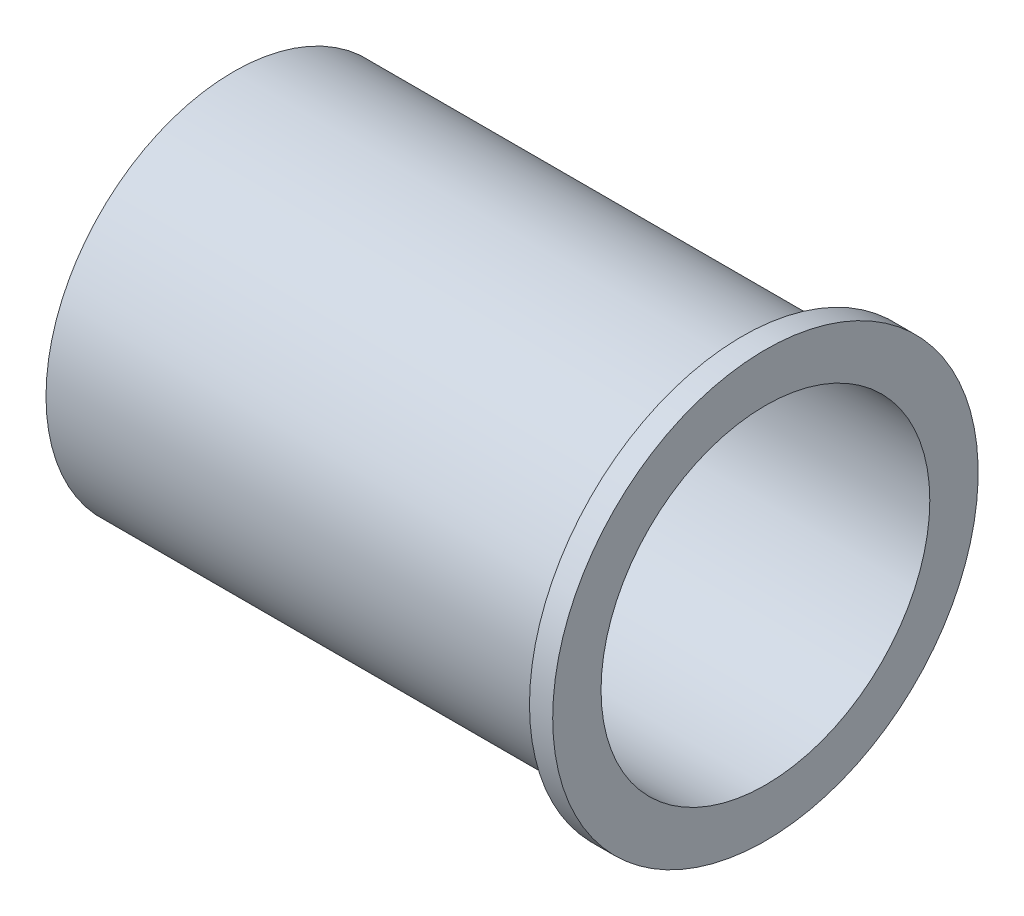
ISO-10303-21;
HEADER;
FILE_DESCRIPTION(('STEP AP214'),'2;1');
FILE_NAME('part.step','',(''),(''),'','','');
FILE_SCHEMA(('AUTOMOTIVE_DESIGN { 1 0 10303 214 1 1 1 1 }'));
ENDSEC;
DATA;
#1=APPLICATION_CONTEXT('core data for automotive mechanical design processes');
#2=APPLICATION_PROTOCOL_DEFINITION('international standard','automotive_design',2000,#1);
#3=PRODUCT_CONTEXT('',#1,'mechanical');
#4=PRODUCT('Part','Part','',(#3));
#5=PRODUCT_RELATED_PRODUCT_CATEGORY('part','',(#4));
#6=PRODUCT_DEFINITION_FORMATION('','',#4);
#7=PRODUCT_DEFINITION_CONTEXT('part definition',#1,'design');
#8=PRODUCT_DEFINITION('design','',#6,#7);
#9=PRODUCT_DEFINITION_SHAPE('','',#8);
#10=(LENGTH_UNIT() NAMED_UNIT(*) SI_UNIT(.MILLI.,.METRE.));
#11=(NAMED_UNIT(*) PLANE_ANGLE_UNIT() SI_UNIT($,.RADIAN.));
#12=(NAMED_UNIT(*) SI_UNIT($,.STERADIAN.) SOLID_ANGLE_UNIT());
#13=UNCERTAINTY_MEASURE_WITH_UNIT(LENGTH_MEASURE(1.E-05),#10,'distance_accuracy_value','');
#14=(GEOMETRIC_REPRESENTATION_CONTEXT(3) GLOBAL_UNCERTAINTY_ASSIGNED_CONTEXT((#13)) GLOBAL_UNIT_ASSIGNED_CONTEXT((#10,
#11,#12)) REPRESENTATION_CONTEXT('',''));
#15=CARTESIAN_POINT('',(0.,0.,0.));
#16=DIRECTION('',(0.,0.,1.));
#17=DIRECTION('',(1.,0.,0.));
#18=AXIS2_PLACEMENT_3D('',#15,#16,#17);
#19=CARTESIAN_POINT('',(-137.5,48.5,0.));
#20=DIRECTION('',(1.,0.,0.));
#21=DIRECTION('',(0.,0.,-1.));
#22=AXIS2_PLACEMENT_3D('',#19,#20,#21);
#23=PLANE('',#22);
#24=CARTESIAN_POINT('',(-137.5,0.,0.));
#25=DIRECTION('',(-1.,0.,0.));
#26=DIRECTION('',(0.,0.,1.));
#27=AXIS2_PLACEMENT_3D('',#24,#25,#26);
#28=CIRCLE('',#27,42.5);
#29=CARTESIAN_POINT('',(-137.5,0.,42.5));
#30=VERTEX_POINT('',#29);
#31=EDGE_CURVE('E10',#30,#30,#28,.T.);
#32=ORIENTED_EDGE('',*,*,#31,.F.);
#33=EDGE_LOOP('',(#32));
#34=FACE_BOUND('',#33,.T.);
#35=CARTESIAN_POINT('',(-137.5,0.,0.));
#36=DIRECTION('',(-1.,0.,0.));
#37=DIRECTION('',(0.,0.,1.));
#38=AXIS2_PLACEMENT_3D('',#35,#36,#37);
#39=CIRCLE('',#38,48.5);
#40=CARTESIAN_POINT('',(-137.5,0.,48.5));
#41=VERTEX_POINT('',#40);
#42=EDGE_CURVE('E60',#41,#41,#39,.T.);
#43=ORIENTED_EDGE('',*,*,#42,.T.);
#44=EDGE_LOOP('',(#43));
#45=FACE_BOUND('',#44,.T.);
#46=ADVANCED_FACE('F34',(#34,#45),#23,.F.);
#47=CARTESIAN_POINT('',(-94.8899371069183,0.,0.));
#48=DIRECTION('',(-1.,0.,0.));
#49=DIRECTION('',(0.,0.,1.));
#50=AXIS2_PLACEMENT_3D('',#47,#48,#49);
#51=CYLINDRICAL_SURFACE('',#50,42.5);
#52=CARTESIAN_POINT('',(0.,0.,0.));
#53=DIRECTION('',(-1.,0.,0.));
#54=DIRECTION('',(0.,0.,1.));
#55=AXIS2_PLACEMENT_3D('',#52,#53,#54);
#56=CIRCLE('',#55,42.5);
#57=CARTESIAN_POINT('',(0.,0.,42.5));
#58=VERTEX_POINT('',#57);
#59=EDGE_CURVE('E41',#58,#58,#56,.T.);
#60=ORIENTED_EDGE('',*,*,#59,.F.);
#61=EDGE_LOOP('',(#60));
#62=FACE_BOUND('',#61,.T.);
#63=ORIENTED_EDGE('',*,*,#31,.T.);
#64=EDGE_LOOP('',(#63));
#65=FACE_BOUND('',#64,.T.);
#66=ADVANCED_FACE('F85',(#62,#65),#51,.F.);
#67=CARTESIAN_POINT('',(0.,42.5,0.));
#68=DIRECTION('',(-1.,0.,0.));
#69=DIRECTION('',(0.,0.,1.));
#70=AXIS2_PLACEMENT_3D('',#67,#68,#69);
#71=PLANE('',#70);
#72=CARTESIAN_POINT('',(0.,0.,0.));
#73=DIRECTION('',(-1.,0.,0.));
#74=DIRECTION('',(0.,0.,1.));
#75=AXIS2_PLACEMENT_3D('',#72,#73,#74);
#76=CIRCLE('',#75,55.);
#77=CARTESIAN_POINT('',(0.,0.,55.));
#78=VERTEX_POINT('',#77);
#79=EDGE_CURVE('E44',#78,#78,#76,.T.);
#80=ORIENTED_EDGE('',*,*,#79,.F.);
#81=EDGE_LOOP('',(#80));
#82=FACE_BOUND('',#81,.T.);
#83=ORIENTED_EDGE('',*,*,#59,.T.);
#84=EDGE_LOOP('',(#83));
#85=FACE_BOUND('',#84,.T.);
#86=ADVANCED_FACE('F77',(#82,#85),#71,.F.);
#87=CARTESIAN_POINT('',(-94.8899371069183,0.,0.));
#88=DIRECTION('',(-1.,0.,0.));
#89=DIRECTION('',(0.,0.,1.));
#90=AXIS2_PLACEMENT_3D('',#87,#88,#89);
#91=CYLINDRICAL_SURFACE('',#90,55.);
#92=CARTESIAN_POINT('',(-5.99999999999999,0.,0.));
#93=DIRECTION('',(-1.,0.,0.));
#94=DIRECTION('',(0.,0.,1.));
#95=AXIS2_PLACEMENT_3D('',#92,#93,#94);
#96=CIRCLE('',#95,55.);
#97=CARTESIAN_POINT('',(-5.99999999999999,0.,55.));
#98=VERTEX_POINT('',#97);
#99=EDGE_CURVE('E47',#98,#98,#96,.T.);
#100=ORIENTED_EDGE('',*,*,#99,.F.);
#101=EDGE_LOOP('',(#100));
#102=FACE_BOUND('',#101,.T.);
#103=ORIENTED_EDGE('',*,*,#79,.T.);
#104=EDGE_LOOP('',(#103));
#105=FACE_BOUND('',#104,.T.);
#106=ADVANCED_FACE('F71',(#102,#105),#91,.T.);
#107=CARTESIAN_POINT('',(-5.99999999999999,48.5,0.));
#108=DIRECTION('',(1.,0.,0.));
#109=DIRECTION('',(0.,0.,-1.));
#110=AXIS2_PLACEMENT_3D('',#107,#108,#109);
#111=PLANE('',#110);
#112=CARTESIAN_POINT('',(-5.99999999999999,0.,0.));
#113=DIRECTION('',(-1.,0.,0.));
#114=DIRECTION('',(0.,0.,1.));
#115=AXIS2_PLACEMENT_3D('',#112,#113,#114);
#116=CIRCLE('',#115,48.5);
#117=CARTESIAN_POINT('',(-5.99999999999999,0.,48.5));
#118=VERTEX_POINT('',#117);
#119=EDGE_CURVE('E53',#118,#118,#116,.T.);
#120=ORIENTED_EDGE('',*,*,#119,.F.);
#121=EDGE_LOOP('',(#120));
#122=FACE_BOUND('',#121,.T.);
#123=ORIENTED_EDGE('',*,*,#99,.T.);
#124=EDGE_LOOP('',(#123));
#125=FACE_BOUND('',#124,.T.);
#126=ADVANCED_FACE('F65',(#122,#125),#111,.F.);
#127=CARTESIAN_POINT('',(-94.8899371069183,0.,0.));
#128=DIRECTION('',(-1.,0.,0.));
#129=DIRECTION('',(0.,0.,1.));
#130=AXIS2_PLACEMENT_3D('',#127,#128,#129);
#131=CYLINDRICAL_SURFACE('',#130,48.5);
#132=ORIENTED_EDGE('',*,*,#42,.F.);
#133=EDGE_LOOP('',(#132));
#134=FACE_BOUND('',#133,.T.);
#135=ORIENTED_EDGE('',*,*,#119,.T.);
#136=EDGE_LOOP('',(#135));
#137=FACE_BOUND('',#136,.T.);
#138=ADVANCED_FACE('F62',(#134,#137),#131,.T.);
#139=CLOSED_SHELL('',(#46,#66,#86,#106,#126,#138));
#140=MANIFOLD_SOLID_BREP('B2',#139);
#141=ADVANCED_BREP_SHAPE_REPRESENTATION('',(#18,#140),#14);
#142=SHAPE_DEFINITION_REPRESENTATION(#9,#141);
ENDSEC;
END-ISO-10303-21;
